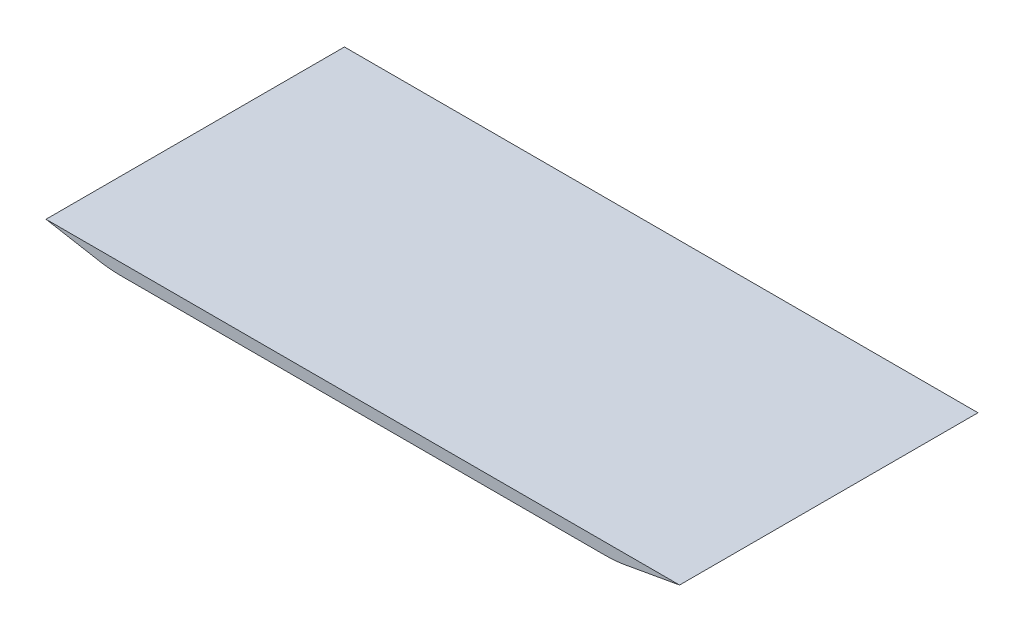
ISO-10303-21;
HEADER;
FILE_DESCRIPTION(('STEP AP214'),'2;1');
FILE_NAME('part.step','',(''),(''),'','','');
FILE_SCHEMA(('AUTOMOTIVE_DESIGN { 1 0 10303 214 1 1 1 1 }'));
ENDSEC;
DATA;
#1=APPLICATION_CONTEXT('core data for automotive mechanical design processes');
#2=APPLICATION_PROTOCOL_DEFINITION('international standard','automotive_design',2000,#1);
#3=PRODUCT_CONTEXT('',#1,'mechanical');
#4=PRODUCT('Part','Part','',(#3));
#5=PRODUCT_RELATED_PRODUCT_CATEGORY('part','',(#4));
#6=PRODUCT_DEFINITION_FORMATION('','',#4);
#7=PRODUCT_DEFINITION_CONTEXT('part definition',#1,'design');
#8=PRODUCT_DEFINITION('design','',#6,#7);
#9=PRODUCT_DEFINITION_SHAPE('','',#8);
#10=(LENGTH_UNIT() NAMED_UNIT(*) SI_UNIT(.MILLI.,.METRE.));
#11=(NAMED_UNIT(*) PLANE_ANGLE_UNIT() SI_UNIT($,.RADIAN.));
#12=(NAMED_UNIT(*) SI_UNIT($,.STERADIAN.) SOLID_ANGLE_UNIT());
#13=UNCERTAINTY_MEASURE_WITH_UNIT(LENGTH_MEASURE(1.E-05),#10,'distance_accuracy_value','');
#14=(GEOMETRIC_REPRESENTATION_CONTEXT(3) GLOBAL_UNCERTAINTY_ASSIGNED_CONTEXT((#13)) GLOBAL_UNIT_ASSIGNED_CONTEXT((#10,
#11,#12)) REPRESENTATION_CONTEXT('',''));
#15=CARTESIAN_POINT('',(0.,0.,0.));
#16=DIRECTION('',(0.,0.,1.));
#17=DIRECTION('',(1.,0.,0.));
#18=AXIS2_PLACEMENT_3D('',#15,#16,#17);
#19=CARTESIAN_POINT('',(248.,-5.,130.));
#20=DIRECTION('',(0.,-1.,0.));
#21=DIRECTION('',(1.,0.,0.));
#22=AXIS2_PLACEMENT_3D('',#19,#20,#21);
#23=PLANE('',#22);
#24=DIRECTION('',(-1.,0.,0.));
#25=VECTOR('',#24,1.);
#26=CARTESIAN_POINT('',(248.,-5.,0.));
#27=LINE('',#26,#25);
#28=CARTESIAN_POINT('',(243.570746933442,-5.,0.));
#29=VERTEX_POINT('',#28);
#30=CARTESIAN_POINT('',(32.429253066558,-5.00000000000013,0.));
#31=VERTEX_POINT('',#30);
#32=EDGE_CURVE('E114',#29,#31,#27,.T.);
#33=ORIENTED_EDGE('',*,*,#32,.F.);
#34=DIRECTION('',(0.,0.,-1.));
#35=VECTOR('',#34,1.);
#36=CARTESIAN_POINT('',(243.570746933442,-5.,130.));
#37=LINE('',#36,#35);
#38=CARTESIAN_POINT('',(243.570746933442,-5.,130.));
#39=VERTEX_POINT('',#38);
#40=EDGE_CURVE('E134',#29,#39,#37,.F.);
#41=ORIENTED_EDGE('',*,*,#40,.T.);
#42=DIRECTION('',(-1.,0.,0.));
#43=VECTOR('',#42,1.);
#44=CARTESIAN_POINT('',(248.,-5.,130.));
#45=LINE('',#44,#43);
#46=CARTESIAN_POINT('',(32.429253066558,-5.00000000000013,130.));
#47=VERTEX_POINT('',#46);
#48=EDGE_CURVE('E97',#39,#47,#45,.T.);
#49=ORIENTED_EDGE('',*,*,#48,.T.);
#50=DIRECTION('',(0.,0.,-1.));
#51=VECTOR('',#50,1.);
#52=CARTESIAN_POINT('',(32.429253066558,-5.00000000000013,130.));
#53=LINE('',#52,#51);
#54=EDGE_CURVE('E131',#47,#31,#53,.T.);
#55=ORIENTED_EDGE('',*,*,#54,.T.);
#56=EDGE_LOOP('',(#33,#41,#49,#55));
#57=FACE_BOUND('',#56,.T.);
#58=ADVANCED_FACE('F39',(#57),#23,.T.);
#59=CARTESIAN_POINT('',(276.,0.,130.));
#60=DIRECTION('',(0.175790638483657,-0.984427575508482,0.));
#61=DIRECTION('',(0.984427575508482,0.175790638483657,0.));
#62=AXIS2_PLACEMENT_3D('',#59,#60,#61);
#63=PLANE('',#62);
#64=DIRECTION('',(-0.984427575508482,-0.175790638483657,0.));
#65=VECTOR('',#64,1.);
#66=CARTESIAN_POINT('',(276.,0.,130.));
#67=LINE('',#66,#65);
#68=CARTESIAN_POINT('',(276.,0.,130.));
#69=VERTEX_POINT('',#68);
#70=CARTESIAN_POINT('',(252.360278857625,-4.22137877542409,130.));
#71=VERTEX_POINT('',#70);
#72=EDGE_CURVE('E106',#69,#71,#67,.T.);
#73=ORIENTED_EDGE('',*,*,#72,.T.);
#74=DIRECTION('',(0.,0.,-1.));
#75=VECTOR('',#74,1.);
#76=CARTESIAN_POINT('',(252.360278857625,-4.22137877542409,130.));
#77=LINE('',#76,#75);
#78=CARTESIAN_POINT('',(252.360278857625,-4.22137877542409,0.));
#79=VERTEX_POINT('',#78);
#80=EDGE_CURVE('E123',#71,#79,#77,.T.);
#81=ORIENTED_EDGE('',*,*,#80,.T.);
#82=DIRECTION('',(-0.984427575508482,-0.175790638483657,0.));
#83=VECTOR('',#82,1.);
#84=CARTESIAN_POINT('',(276.,0.,0.));
#85=LINE('',#84,#83);
#86=CARTESIAN_POINT('',(276.,0.,0.));
#87=VERTEX_POINT('',#86);
#88=EDGE_CURVE('E120',#87,#79,#85,.T.);
#89=ORIENTED_EDGE('',*,*,#88,.F.);
#90=DIRECTION('',(0.,0.,-1.));
#91=VECTOR('',#90,1.);
#92=CARTESIAN_POINT('',(276.,0.,130.));
#93=LINE('',#92,#91);
#94=EDGE_CURVE('E105',#69,#87,#93,.T.);
#95=ORIENTED_EDGE('',*,*,#94,.F.);
#96=EDGE_LOOP('',(#73,#81,#89,#95));
#97=FACE_BOUND('',#96,.T.);
#98=ADVANCED_FACE('F141',(#97),#63,.T.);
#99=CARTESIAN_POINT('',(0.,0.,130.));
#100=DIRECTION('',(0.,1.,0.));
#101=DIRECTION('',(0.,0.,1.));
#102=AXIS2_PLACEMENT_3D('',#99,#100,#101);
#103=PLANE('',#102);
#104=DIRECTION('',(1.,0.,0.));
#105=VECTOR('',#104,1.);
#106=CARTESIAN_POINT('',(0.,0.,0.));
#107=LINE('',#106,#105);
#108=CARTESIAN_POINT('',(0.,0.,0.));
#109=VERTEX_POINT('',#108);
#110=EDGE_CURVE('E104',#109,#87,#107,.T.);
#111=ORIENTED_EDGE('',*,*,#110,.F.);
#112=DIRECTION('',(0.,0.,-1.));
#113=VECTOR('',#112,1.);
#114=CARTESIAN_POINT('',(0.,0.,130.));
#115=LINE('',#114,#113);
#116=CARTESIAN_POINT('',(0.,0.,130.));
#117=VERTEX_POINT('',#116);
#118=EDGE_CURVE('E93',#117,#109,#115,.T.);
#119=ORIENTED_EDGE('',*,*,#118,.F.);
#120=DIRECTION('',(1.,0.,0.));
#121=VECTOR('',#120,1.);
#122=CARTESIAN_POINT('',(0.,0.,130.));
#123=LINE('',#122,#121);
#124=EDGE_CURVE('E96',#117,#69,#123,.T.);
#125=ORIENTED_EDGE('',*,*,#124,.T.);
#126=ORIENTED_EDGE('',*,*,#94,.T.);
#127=EDGE_LOOP('',(#111,#119,#125,#126));
#128=FACE_BOUND('',#127,.T.);
#129=ADVANCED_FACE('F101',(#128),#103,.T.);
#130=CARTESIAN_POINT('',(28.,-5.00000000000013,130.));
#131=DIRECTION('',(-0.175790638483662,-0.984427575508481,0.));
#132=DIRECTION('',(0.984427575508481,-0.175790638483662,0.));
#133=AXIS2_PLACEMENT_3D('',#130,#131,#132);
#134=PLANE('',#133);
#135=DIRECTION('',(-0.984427575508481,0.175790638483662,0.));
#136=VECTOR('',#135,1.);
#137=CARTESIAN_POINT('',(28.,-5.00000000000013,0.));
#138=LINE('',#137,#136);
#139=CARTESIAN_POINT('',(23.6397211423749,-4.22137877542419,0.));
#140=VERTEX_POINT('',#139);
#141=EDGE_CURVE('E117',#140,#109,#138,.T.);
#142=ORIENTED_EDGE('',*,*,#141,.F.);
#143=DIRECTION('',(0.,0.,-1.));
#144=VECTOR('',#143,1.);
#145=CARTESIAN_POINT('',(23.6397211423749,-4.22137877542419,130.));
#146=LINE('',#145,#144);
#147=CARTESIAN_POINT('',(23.6397211423749,-4.22137877542419,130.));
#148=VERTEX_POINT('',#147);
#149=EDGE_CURVE('E11',#140,#148,#146,.F.);
#150=ORIENTED_EDGE('',*,*,#149,.T.);
#151=DIRECTION('',(-0.984427575508481,0.175790638483662,0.));
#152=VECTOR('',#151,1.);
#153=CARTESIAN_POINT('',(28.,-5.00000000000013,130.));
#154=LINE('',#153,#152);
#155=EDGE_CURVE('E90',#148,#117,#154,.T.);
#156=ORIENTED_EDGE('',*,*,#155,.T.);
#157=ORIENTED_EDGE('',*,*,#118,.T.);
#158=EDGE_LOOP('',(#142,#150,#156,#157));
#159=FACE_BOUND('',#158,.T.);
#160=ADVANCED_FACE('F92',(#159),#134,.T.);
#161=CARTESIAN_POINT('',(0.,0.,130.));
#162=DIRECTION('',(0.,0.,-1.));
#163=DIRECTION('',(-1.,0.,0.));
#164=AXIS2_PLACEMENT_3D('',#161,#162,#163);
#165=PLANE('',#164);
#166=ORIENTED_EDGE('',*,*,#48,.F.);
#167=CARTESIAN_POINT('',(243.570746933442,45.,130.));
#168=DIRECTION('',(0.,0.,-1.));
#169=DIRECTION('',(-1.,0.,0.));
#170=AXIS2_PLACEMENT_3D('',#167,#168,#169);
#171=CIRCLE('',#170,50.);
#172=EDGE_CURVE('E47',#39,#71,#171,.F.);
#173=ORIENTED_EDGE('',*,*,#172,.T.);
#174=ORIENTED_EDGE('',*,*,#72,.F.);
#175=ORIENTED_EDGE('',*,*,#124,.F.);
#176=ORIENTED_EDGE('',*,*,#155,.F.);
#177=CARTESIAN_POINT('',(32.429253066558,44.9999999999999,130.));
#178=DIRECTION('',(0.,0.,-1.));
#179=DIRECTION('',(-1.,0.,0.));
#180=AXIS2_PLACEMENT_3D('',#177,#178,#179);
#181=CIRCLE('',#180,50.);
#182=EDGE_CURVE('E59',#148,#47,#181,.F.);
#183=ORIENTED_EDGE('',*,*,#182,.T.);
#184=EDGE_LOOP('',(#166,#173,#174,#175,#176,#183));
#185=FACE_BOUND('',#184,.T.);
#186=ADVANCED_FACE('F108',(#185),#165,.F.);
#187=CARTESIAN_POINT('',(0.,0.,0.));
#188=DIRECTION('',(0.,0.,-1.));
#189=DIRECTION('',(-1.,0.,0.));
#190=AXIS2_PLACEMENT_3D('',#187,#188,#189);
#191=PLANE('',#190);
#192=ORIENTED_EDGE('',*,*,#88,.T.);
#193=CARTESIAN_POINT('',(243.570746933442,45.,0.));
#194=DIRECTION('',(0.,0.,-1.));
#195=DIRECTION('',(-1.,0.,0.));
#196=AXIS2_PLACEMENT_3D('',#193,#194,#195);
#197=CIRCLE('',#196,50.);
#198=EDGE_CURVE('E129',#79,#29,#197,.T.);
#199=ORIENTED_EDGE('',*,*,#198,.T.);
#200=ORIENTED_EDGE('',*,*,#32,.T.);
#201=CARTESIAN_POINT('',(32.429253066558,44.9999999999999,0.));
#202=DIRECTION('',(0.,0.,-1.));
#203=DIRECTION('',(-1.,0.,0.));
#204=AXIS2_PLACEMENT_3D('',#201,#202,#203);
#205=CIRCLE('',#204,50.);
#206=EDGE_CURVE('E127',#31,#140,#205,.T.);
#207=ORIENTED_EDGE('',*,*,#206,.T.);
#208=ORIENTED_EDGE('',*,*,#141,.T.);
#209=ORIENTED_EDGE('',*,*,#110,.T.);
#210=EDGE_LOOP('',(#192,#199,#200,#207,#208,#209));
#211=FACE_BOUND('',#210,.T.);
#212=ADVANCED_FACE('F146',(#211),#191,.T.);
#213=CARTESIAN_POINT('',(243.570746933442,45.,130.));
#214=DIRECTION('',(0.,0.,-1.));
#215=DIRECTION('',(-1.,0.,0.));
#216=AXIS2_PLACEMENT_3D('',#213,#214,#215);
#217=CYLINDRICAL_SURFACE('',#216,50.);
#218=ORIENTED_EDGE('',*,*,#172,.F.);
#219=ORIENTED_EDGE('',*,*,#40,.F.);
#220=ORIENTED_EDGE('',*,*,#198,.F.);
#221=ORIENTED_EDGE('',*,*,#80,.F.);
#222=EDGE_LOOP('',(#218,#219,#220,#221));
#223=FACE_BOUND('',#222,.T.);
#224=ADVANCED_FACE('F143',(#223),#217,.T.);
#225=CARTESIAN_POINT('',(32.429253066558,44.9999999999999,130.));
#226=DIRECTION('',(0.,0.,-1.));
#227=DIRECTION('',(-1.,0.,0.));
#228=AXIS2_PLACEMENT_3D('',#225,#226,#227);
#229=CYLINDRICAL_SURFACE('',#228,50.);
#230=ORIENTED_EDGE('',*,*,#182,.F.);
#231=ORIENTED_EDGE('',*,*,#149,.F.);
#232=ORIENTED_EDGE('',*,*,#206,.F.);
#233=ORIENTED_EDGE('',*,*,#54,.F.);
#234=EDGE_LOOP('',(#230,#231,#232,#233));
#235=FACE_BOUND('',#234,.T.);
#236=ADVANCED_FACE('F41',(#235),#229,.T.);
#237=CLOSED_SHELL('',(#58,#98,#129,#160,#186,#212,#224,#236));
#238=MANIFOLD_SOLID_BREP('B2',#237);
#239=ADVANCED_BREP_SHAPE_REPRESENTATION('',(#18,#238),#14);
#240=SHAPE_DEFINITION_REPRESENTATION(#9,#239);
ENDSEC;
END-ISO-10303-21;
